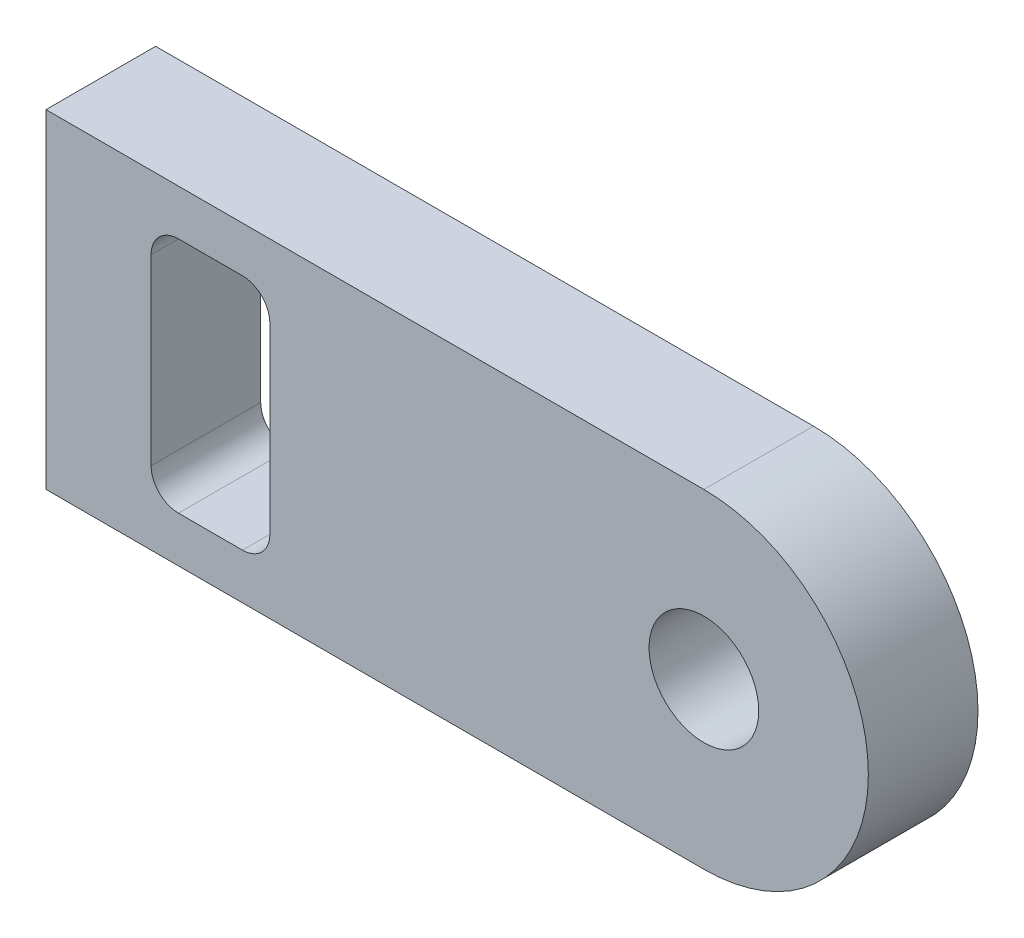
ISO-10303-21;
HEADER;
FILE_DESCRIPTION(('STEP AP214'),'2;1');
FILE_NAME('part.step','',(''),(''),'','','');
FILE_SCHEMA(('AUTOMOTIVE_DESIGN { 1 0 10303 214 1 1 1 1 }'));
ENDSEC;
DATA;
#1=APPLICATION_CONTEXT('core data for automotive mechanical design processes');
#2=APPLICATION_PROTOCOL_DEFINITION('international standard','automotive_design',2000,#1);
#3=PRODUCT_CONTEXT('',#1,'mechanical');
#4=PRODUCT('Part','Part','',(#3));
#5=PRODUCT_RELATED_PRODUCT_CATEGORY('part','',(#4));
#6=PRODUCT_DEFINITION_FORMATION('','',#4);
#7=PRODUCT_DEFINITION_CONTEXT('part definition',#1,'design');
#8=PRODUCT_DEFINITION('design','',#6,#7);
#9=PRODUCT_DEFINITION_SHAPE('','',#8);
#10=(LENGTH_UNIT() NAMED_UNIT(*) SI_UNIT(.MILLI.,.METRE.));
#11=(NAMED_UNIT(*) PLANE_ANGLE_UNIT() SI_UNIT($,.RADIAN.));
#12=(NAMED_UNIT(*) SI_UNIT($,.STERADIAN.) SOLID_ANGLE_UNIT());
#13=UNCERTAINTY_MEASURE_WITH_UNIT(LENGTH_MEASURE(1.E-05),#10,'distance_accuracy_value','');
#14=(GEOMETRIC_REPRESENTATION_CONTEXT(3) GLOBAL_UNCERTAINTY_ASSIGNED_CONTEXT((#13)) GLOBAL_UNIT_ASSIGNED_CONTEXT((#10,
#11,#12)) REPRESENTATION_CONTEXT('',''));
#15=CARTESIAN_POINT('',(0.,0.,0.));
#16=DIRECTION('',(0.,0.,1.));
#17=DIRECTION('',(1.,0.,0.));
#18=AXIS2_PLACEMENT_3D('',#15,#16,#17);
#19=CARTESIAN_POINT('',(201.0978533093,269.1465473352,3.));
#20=DIRECTION('',(0.,0.,1.));
#21=DIRECTION('',(1.,0.,0.));
#22=AXIS2_PLACEMENT_3D('',#19,#20,#21);
#23=PLANE('',#22);
#24=CARTESIAN_POINT('',(201.0978533093,269.1465473352,3.));
#25=DIRECTION('',(0.,0.,1.));
#26=DIRECTION('',(1.,0.,0.));
#27=AXIS2_PLACEMENT_3D('',#24,#25,#26);
#28=CIRCLE('',#27,1.5);
#29=CARTESIAN_POINT('',(202.5978533093,269.1465473352,3.));
#30=VERTEX_POINT('',#29);
#31=EDGE_CURVE('E187',#30,#30,#28,.T.);
#32=ORIENTED_EDGE('',*,*,#31,.F.);
#33=EDGE_LOOP('',(#32));
#34=FACE_BOUND('',#33,.T.);
#35=CARTESIAN_POINT('',(201.0978533093,269.1465473352,3.));
#36=DIRECTION('',(0.,0.,1.));
#37=DIRECTION('',(1.,0.,0.));
#38=AXIS2_PLACEMENT_3D('',#35,#36,#37);
#39=CIRCLE('',#38,4.49999999999998);
#40=CARTESIAN_POINT('',(201.0978533093,264.6465473352,3.));
#41=VERTEX_POINT('',#40);
#42=CARTESIAN_POINT('',(201.0978533093,273.6465473352,3.));
#43=VERTEX_POINT('',#42);
#44=EDGE_CURVE('E193',#41,#43,#39,.T.);
#45=ORIENTED_EDGE('',*,*,#44,.T.);
#46=DIRECTION('',(-1.,0.,0.));
#47=VECTOR('',#46,1.);
#48=CARTESIAN_POINT('',(183.0978533093,273.6465473352,3.));
#49=LINE('',#48,#47);
#50=CARTESIAN_POINT('',(183.0978533093,273.6465473352,3.));
#51=VERTEX_POINT('',#50);
#52=EDGE_CURVE('E196',#43,#51,#49,.T.);
#53=ORIENTED_EDGE('',*,*,#52,.T.);
#54=DIRECTION('',(0.,-1.,0.));
#55=VECTOR('',#54,1.);
#56=CARTESIAN_POINT('',(183.0978533093,264.6465473352,3.));
#57=LINE('',#56,#55);
#58=CARTESIAN_POINT('',(183.0978533093,264.6465473352,3.));
#59=VERTEX_POINT('',#58);
#60=EDGE_CURVE('E199',#51,#59,#57,.T.);
#61=ORIENTED_EDGE('',*,*,#60,.T.);
#62=DIRECTION('',(1.,0.,0.));
#63=VECTOR('',#62,1.);
#64=CARTESIAN_POINT('',(201.0978533093,264.6465473352,3.));
#65=LINE('',#64,#63);
#66=EDGE_CURVE('E201',#59,#41,#65,.T.);
#67=ORIENTED_EDGE('',*,*,#66,.T.);
#68=EDGE_LOOP('',(#45,#53,#61,#67));
#69=FACE_BOUND('',#68,.T.);
#70=DIRECTION('',(1.,0.,0.));
#71=VECTOR('',#70,1.);
#72=CARTESIAN_POINT('',(186.7228533093,265.8965473352,3.));
#73=LINE('',#72,#71);
#74=CARTESIAN_POINT('',(186.7228533093,265.8965473352,3.));
#75=VERTEX_POINT('',#74);
#76=CARTESIAN_POINT('',(188.4728533093,265.8965473352,3.));
#77=VERTEX_POINT('',#76);
#78=EDGE_CURVE('E130',#75,#77,#73,.T.);
#79=ORIENTED_EDGE('',*,*,#78,.F.);
#80=CARTESIAN_POINT('',(186.7228533093,266.6465473352,3.));
#81=DIRECTION('',(0.,0.,1.));
#82=DIRECTION('',(1.,0.,0.));
#83=AXIS2_PLACEMENT_3D('',#80,#81,#82);
#84=CIRCLE('',#83,0.749999999999987);
#85=CARTESIAN_POINT('',(185.9728533093,266.6465473352,3.));
#86=VERTEX_POINT('',#85);
#87=EDGE_CURVE('E122',#86,#75,#84,.T.);
#88=ORIENTED_EDGE('',*,*,#87,.F.);
#89=DIRECTION('',(0.,-1.,0.));
#90=VECTOR('',#89,1.);
#91=CARTESIAN_POINT('',(185.9728533093,271.6465473352,3.));
#92=LINE('',#91,#90);
#93=CARTESIAN_POINT('',(185.9728533093,271.6465473352,3.));
#94=VERTEX_POINT('',#93);
#95=EDGE_CURVE('E155',#94,#86,#92,.T.);
#96=ORIENTED_EDGE('',*,*,#95,.F.);
#97=CARTESIAN_POINT('',(186.7228533093,271.6465473352,3.));
#98=DIRECTION('',(0.,0.,1.));
#99=DIRECTION('',(1.,0.,0.));
#100=AXIS2_PLACEMENT_3D('',#97,#98,#99);
#101=CIRCLE('',#100,0.750000000000015);
#102=CARTESIAN_POINT('',(186.7228533093,272.3965473352,3.));
#103=VERTEX_POINT('',#102);
#104=EDGE_CURVE('E153',#103,#94,#101,.T.);
#105=ORIENTED_EDGE('',*,*,#104,.F.);
#106=DIRECTION('',(-1.,0.,0.));
#107=VECTOR('',#106,1.);
#108=CARTESIAN_POINT('',(188.4728533093,272.3965473352,3.));
#109=LINE('',#108,#107);
#110=CARTESIAN_POINT('',(188.4728533093,272.3965473352,3.));
#111=VERTEX_POINT('',#110);
#112=EDGE_CURVE('E151',#111,#103,#109,.T.);
#113=ORIENTED_EDGE('',*,*,#112,.F.);
#114=CARTESIAN_POINT('',(188.4728533093,271.6465473352,3.));
#115=DIRECTION('',(0.,0.,1.));
#116=DIRECTION('',(1.,0.,0.));
#117=AXIS2_PLACEMENT_3D('',#114,#115,#116);
#118=CIRCLE('',#117,0.750000000000015);
#119=CARTESIAN_POINT('',(189.2228533093,271.6465473352,3.));
#120=VERTEX_POINT('',#119);
#121=EDGE_CURVE('E149',#120,#111,#118,.T.);
#122=ORIENTED_EDGE('',*,*,#121,.F.);
#123=DIRECTION('',(0.,1.,0.));
#124=VECTOR('',#123,1.);
#125=CARTESIAN_POINT('',(189.2228533093,266.6465473352,3.));
#126=LINE('',#125,#124);
#127=CARTESIAN_POINT('',(189.2228533093,266.6465473352,3.));
#128=VERTEX_POINT('',#127);
#129=EDGE_CURVE('E145',#128,#120,#126,.T.);
#130=ORIENTED_EDGE('',*,*,#129,.F.);
#131=CARTESIAN_POINT('',(188.4728533093,266.6465473352,3.));
#132=DIRECTION('',(0.,0.,1.));
#133=DIRECTION('',(1.,0.,0.));
#134=AXIS2_PLACEMENT_3D('',#131,#132,#133);
#135=CIRCLE('',#134,0.749999999999987);
#136=EDGE_CURVE('E143',#77,#128,#135,.T.);
#137=ORIENTED_EDGE('',*,*,#136,.F.);
#138=EDGE_LOOP('',(#79,#88,#96,#105,#113,#122,#130,#137));
#139=FACE_BOUND('',#138,.T.);
#140=ADVANCED_FACE('F33',(#34,#69,#139),#23,.T.);
#141=CARTESIAN_POINT('',(201.0978533093,269.1465473352,0.));
#142=DIRECTION('',(0.,0.,1.));
#143=DIRECTION('',(1.,0.,0.));
#144=AXIS2_PLACEMENT_3D('',#141,#142,#143);
#145=PLANE('',#144);
#146=CARTESIAN_POINT('',(201.0978533093,269.1465473352,0.));
#147=DIRECTION('',(0.,0.,1.));
#148=DIRECTION('',(1.,0.,0.));
#149=AXIS2_PLACEMENT_3D('',#146,#147,#148);
#150=CIRCLE('',#149,1.5);
#151=CARTESIAN_POINT('',(202.5978533093,269.1465473352,0.));
#152=VERTEX_POINT('',#151);
#153=EDGE_CURVE('E138',#152,#152,#150,.T.);
#154=ORIENTED_EDGE('',*,*,#153,.T.);
#155=EDGE_LOOP('',(#154));
#156=FACE_BOUND('',#155,.T.);
#157=CARTESIAN_POINT('',(201.0978533093,269.1465473352,0.));
#158=DIRECTION('',(0.,0.,1.));
#159=DIRECTION('',(1.,0.,0.));
#160=AXIS2_PLACEMENT_3D('',#157,#158,#159);
#161=CIRCLE('',#160,4.49999999999998);
#162=CARTESIAN_POINT('',(201.0978533093,264.6465473352,0.));
#163=VERTEX_POINT('',#162);
#164=CARTESIAN_POINT('',(201.0978533093,273.6465473352,0.));
#165=VERTEX_POINT('',#164);
#166=EDGE_CURVE('E190',#163,#165,#161,.T.);
#167=ORIENTED_EDGE('',*,*,#166,.F.);
#168=DIRECTION('',(1.,0.,0.));
#169=VECTOR('',#168,1.);
#170=CARTESIAN_POINT('',(201.0978533093,264.6465473352,0.));
#171=LINE('',#170,#169);
#172=CARTESIAN_POINT('',(183.0978533093,264.6465473352,0.));
#173=VERTEX_POINT('',#172);
#174=EDGE_CURVE('E197',#173,#163,#171,.T.);
#175=ORIENTED_EDGE('',*,*,#174,.F.);
#176=DIRECTION('',(0.,-1.,0.));
#177=VECTOR('',#176,1.);
#178=CARTESIAN_POINT('',(183.0978533093,264.6465473352,0.));
#179=LINE('',#178,#177);
#180=CARTESIAN_POINT('',(183.0978533093,273.6465473352,0.));
#181=VERTEX_POINT('',#180);
#182=EDGE_CURVE('E208',#181,#173,#179,.T.);
#183=ORIENTED_EDGE('',*,*,#182,.F.);
#184=DIRECTION('',(-1.,0.,0.));
#185=VECTOR('',#184,1.);
#186=CARTESIAN_POINT('',(183.0978533093,273.6465473352,0.));
#187=LINE('',#186,#185);
#188=EDGE_CURVE('E206',#165,#181,#187,.T.);
#189=ORIENTED_EDGE('',*,*,#188,.F.);
#190=EDGE_LOOP('',(#167,#175,#183,#189));
#191=FACE_BOUND('',#190,.T.);
#192=CARTESIAN_POINT('',(186.7228533093,266.6465473352,0.));
#193=DIRECTION('',(0.,0.,1.));
#194=DIRECTION('',(1.,0.,0.));
#195=AXIS2_PLACEMENT_3D('',#192,#193,#194);
#196=CIRCLE('',#195,0.749999999999987);
#197=CARTESIAN_POINT('',(185.9728533093,266.6465473352,0.));
#198=VERTEX_POINT('',#197);
#199=CARTESIAN_POINT('',(186.7228533093,265.8965473352,0.));
#200=VERTEX_POINT('',#199);
#201=EDGE_CURVE('E56',#198,#200,#196,.T.);
#202=ORIENTED_EDGE('',*,*,#201,.T.);
#203=DIRECTION('',(1.,0.,0.));
#204=VECTOR('',#203,1.);
#205=CARTESIAN_POINT('',(186.7228533093,265.8965473352,0.));
#206=LINE('',#205,#204);
#207=CARTESIAN_POINT('',(188.4728533093,265.8965473352,0.));
#208=VERTEX_POINT('',#207);
#209=EDGE_CURVE('E137',#200,#208,#206,.T.);
#210=ORIENTED_EDGE('',*,*,#209,.T.);
#211=CARTESIAN_POINT('',(188.4728533093,266.6465473352,0.));
#212=DIRECTION('',(0.,0.,1.));
#213=DIRECTION('',(1.,0.,0.));
#214=AXIS2_PLACEMENT_3D('',#211,#212,#213);
#215=CIRCLE('',#214,0.749999999999987);
#216=CARTESIAN_POINT('',(189.2228533093,266.6465473352,0.));
#217=VERTEX_POINT('',#216);
#218=EDGE_CURVE('E159',#208,#217,#215,.T.);
#219=ORIENTED_EDGE('',*,*,#218,.T.);
#220=DIRECTION('',(0.,1.,0.));
#221=VECTOR('',#220,1.);
#222=CARTESIAN_POINT('',(189.2228533093,266.6465473352,0.));
#223=LINE('',#222,#221);
#224=CARTESIAN_POINT('',(189.2228533093,271.6465473352,0.));
#225=VERTEX_POINT('',#224);
#226=EDGE_CURVE('E162',#217,#225,#223,.T.);
#227=ORIENTED_EDGE('',*,*,#226,.T.);
#228=CARTESIAN_POINT('',(188.4728533093,271.6465473352,0.));
#229=DIRECTION('',(0.,0.,1.));
#230=DIRECTION('',(1.,0.,0.));
#231=AXIS2_PLACEMENT_3D('',#228,#229,#230);
#232=CIRCLE('',#231,0.750000000000015);
#233=CARTESIAN_POINT('',(188.4728533093,272.3965473352,0.));
#234=VERTEX_POINT('',#233);
#235=EDGE_CURVE('E165',#225,#234,#232,.T.);
#236=ORIENTED_EDGE('',*,*,#235,.T.);
#237=DIRECTION('',(-1.,0.,0.));
#238=VECTOR('',#237,1.);
#239=CARTESIAN_POINT('',(188.4728533093,272.3965473352,0.));
#240=LINE('',#239,#238);
#241=CARTESIAN_POINT('',(186.7228533093,272.3965473352,0.));
#242=VERTEX_POINT('',#241);
#243=EDGE_CURVE('E168',#234,#242,#240,.T.);
#244=ORIENTED_EDGE('',*,*,#243,.T.);
#245=CARTESIAN_POINT('',(186.7228533093,271.6465473352,0.));
#246=DIRECTION('',(0.,0.,1.));
#247=DIRECTION('',(1.,0.,0.));
#248=AXIS2_PLACEMENT_3D('',#245,#246,#247);
#249=CIRCLE('',#248,0.750000000000015);
#250=CARTESIAN_POINT('',(185.9728533093,271.6465473352,0.));
#251=VERTEX_POINT('',#250);
#252=EDGE_CURVE('E171',#242,#251,#249,.T.);
#253=ORIENTED_EDGE('',*,*,#252,.T.);
#254=DIRECTION('',(0.,-1.,0.));
#255=VECTOR('',#254,1.);
#256=CARTESIAN_POINT('',(185.9728533093,271.6465473352,0.));
#257=LINE('',#256,#255);
#258=EDGE_CURVE('E131',#251,#198,#257,.T.);
#259=ORIENTED_EDGE('',*,*,#258,.T.);
#260=EDGE_LOOP('',(#202,#210,#219,#227,#236,#244,#253,#259));
#261=FACE_BOUND('',#260,.T.);
#262=ADVANCED_FACE('F226',(#156,#191,#261),#145,.F.);
#263=CARTESIAN_POINT('',(201.0978533093,269.1465473352,3.));
#264=DIRECTION('',(0.,0.,-1.));
#265=DIRECTION('',(-1.,0.,0.));
#266=AXIS2_PLACEMENT_3D('',#263,#264,#265);
#267=CYLINDRICAL_SURFACE('',#266,4.49999999999998);
#268=ORIENTED_EDGE('',*,*,#166,.T.);
#269=DIRECTION('',(0.,0.,-1.));
#270=VECTOR('',#269,1.);
#271=CARTESIAN_POINT('',(201.0978533093,273.6465473352,3.));
#272=LINE('',#271,#270);
#273=EDGE_CURVE('E11',#43,#165,#272,.T.);
#274=ORIENTED_EDGE('',*,*,#273,.F.);
#275=ORIENTED_EDGE('',*,*,#44,.F.);
#276=DIRECTION('',(0.,0.,-1.));
#277=VECTOR('',#276,1.);
#278=CARTESIAN_POINT('',(201.0978533093,264.6465473352,3.));
#279=LINE('',#278,#277);
#280=EDGE_CURVE('E203',#41,#163,#279,.T.);
#281=ORIENTED_EDGE('',*,*,#280,.T.);
#282=EDGE_LOOP('',(#268,#274,#275,#281));
#283=FACE_BOUND('',#282,.T.);
#284=ADVANCED_FACE('F35',(#283),#267,.T.);
#285=CARTESIAN_POINT('',(183.0978533093,273.6465473352,3.));
#286=DIRECTION('',(0.,-1.,0.));
#287=DIRECTION('',(0.,0.,-1.));
#288=AXIS2_PLACEMENT_3D('',#285,#286,#287);
#289=PLANE('',#288);
#290=ORIENTED_EDGE('',*,*,#188,.T.);
#291=DIRECTION('',(0.,0.,-1.));
#292=VECTOR('',#291,1.);
#293=CARTESIAN_POINT('',(183.0978533093,273.6465473352,3.));
#294=LINE('',#293,#292);
#295=EDGE_CURVE('E41',#51,#181,#294,.T.);
#296=ORIENTED_EDGE('',*,*,#295,.F.);
#297=ORIENTED_EDGE('',*,*,#52,.F.);
#298=ORIENTED_EDGE('',*,*,#273,.T.);
#299=EDGE_LOOP('',(#290,#296,#297,#298));
#300=FACE_BOUND('',#299,.T.);
#301=ADVANCED_FACE('F236',(#300),#289,.F.);
#302=CARTESIAN_POINT('',(183.0978533093,264.6465473352,3.));
#303=DIRECTION('',(1.,0.,0.));
#304=DIRECTION('',(0.,0.,-1.));
#305=AXIS2_PLACEMENT_3D('',#302,#303,#304);
#306=PLANE('',#305);
#307=ORIENTED_EDGE('',*,*,#182,.T.);
#308=DIRECTION('',(0.,0.,-1.));
#309=VECTOR('',#308,1.);
#310=CARTESIAN_POINT('',(183.0978533093,264.6465473352,3.));
#311=LINE('',#310,#309);
#312=EDGE_CURVE('E213',#59,#173,#311,.T.);
#313=ORIENTED_EDGE('',*,*,#312,.F.);
#314=ORIENTED_EDGE('',*,*,#60,.F.);
#315=ORIENTED_EDGE('',*,*,#295,.T.);
#316=EDGE_LOOP('',(#307,#313,#314,#315));
#317=FACE_BOUND('',#316,.T.);
#318=ADVANCED_FACE('F220',(#317),#306,.F.);
#319=CARTESIAN_POINT('',(201.0978533093,264.6465473352,3.));
#320=DIRECTION('',(0.,1.,0.));
#321=DIRECTION('',(0.,0.,1.));
#322=AXIS2_PLACEMENT_3D('',#319,#320,#321);
#323=PLANE('',#322);
#324=ORIENTED_EDGE('',*,*,#174,.T.);
#325=ORIENTED_EDGE('',*,*,#280,.F.);
#326=ORIENTED_EDGE('',*,*,#66,.F.);
#327=ORIENTED_EDGE('',*,*,#312,.T.);
#328=EDGE_LOOP('',(#324,#325,#326,#327));
#329=FACE_BOUND('',#328,.T.);
#330=ADVANCED_FACE('F230',(#329),#323,.F.);
#331=CARTESIAN_POINT('',(201.0978533093,269.1465473352,3.));
#332=DIRECTION('',(0.,0.,-1.));
#333=DIRECTION('',(-1.,0.,0.));
#334=AXIS2_PLACEMENT_3D('',#331,#332,#333);
#335=CYLINDRICAL_SURFACE('',#334,1.5);
#336=ORIENTED_EDGE('',*,*,#31,.T.);
#337=EDGE_LOOP('',(#336));
#338=FACE_BOUND('',#337,.T.);
#339=ORIENTED_EDGE('',*,*,#153,.F.);
#340=EDGE_LOOP('',(#339));
#341=FACE_BOUND('',#340,.T.);
#342=ADVANCED_FACE('F253',(#338,#341),#335,.F.);
#343=CARTESIAN_POINT('',(186.7228533093,266.6465473352,3.));
#344=DIRECTION('',(0.,0.,-1.));
#345=DIRECTION('',(-1.,0.,0.));
#346=AXIS2_PLACEMENT_3D('',#343,#344,#345);
#347=CYLINDRICAL_SURFACE('',#346,0.749999999999987);
#348=ORIENTED_EDGE('',*,*,#201,.F.);
#349=DIRECTION('',(0.,0.,-1.));
#350=VECTOR('',#349,1.);
#351=CARTESIAN_POINT('',(185.9728533093,266.6465473352,3.));
#352=LINE('',#351,#350);
#353=EDGE_CURVE('E126',#86,#198,#352,.T.);
#354=ORIENTED_EDGE('',*,*,#353,.F.);
#355=ORIENTED_EDGE('',*,*,#87,.T.);
#356=DIRECTION('',(0.,0.,-1.));
#357=VECTOR('',#356,1.);
#358=CARTESIAN_POINT('',(186.7228533093,265.8965473352,3.));
#359=LINE('',#358,#357);
#360=EDGE_CURVE('E125',#75,#200,#359,.T.);
#361=ORIENTED_EDGE('',*,*,#360,.T.);
#362=EDGE_LOOP('',(#348,#354,#355,#361));
#363=FACE_BOUND('',#362,.T.);
#364=ADVANCED_FACE('F124',(#363),#347,.F.);
#365=CARTESIAN_POINT('',(186.7228533093,265.8965473352,3.));
#366=DIRECTION('',(0.,1.,0.));
#367=DIRECTION('',(0.,0.,1.));
#368=AXIS2_PLACEMENT_3D('',#365,#366,#367);
#369=PLANE('',#368);
#370=ORIENTED_EDGE('',*,*,#209,.F.);
#371=ORIENTED_EDGE('',*,*,#360,.F.);
#372=ORIENTED_EDGE('',*,*,#78,.T.);
#373=DIRECTION('',(0.,0.,-1.));
#374=VECTOR('',#373,1.);
#375=CARTESIAN_POINT('',(188.4728533093,265.8965473352,3.));
#376=LINE('',#375,#374);
#377=EDGE_CURVE('E139',#77,#208,#376,.T.);
#378=ORIENTED_EDGE('',*,*,#377,.T.);
#379=EDGE_LOOP('',(#370,#371,#372,#378));
#380=FACE_BOUND('',#379,.T.);
#381=ADVANCED_FACE('F134',(#380),#369,.T.);
#382=CARTESIAN_POINT('',(188.4728533093,266.6465473352,3.));
#383=DIRECTION('',(0.,0.,-1.));
#384=DIRECTION('',(-1.,0.,0.));
#385=AXIS2_PLACEMENT_3D('',#382,#383,#384);
#386=CYLINDRICAL_SURFACE('',#385,0.749999999999987);
#387=ORIENTED_EDGE('',*,*,#218,.F.);
#388=ORIENTED_EDGE('',*,*,#377,.F.);
#389=ORIENTED_EDGE('',*,*,#136,.T.);
#390=DIRECTION('',(0.,0.,-1.));
#391=VECTOR('',#390,1.);
#392=CARTESIAN_POINT('',(189.2228533093,266.6465473352,3.));
#393=LINE('',#392,#391);
#394=EDGE_CURVE('E184',#128,#217,#393,.T.);
#395=ORIENTED_EDGE('',*,*,#394,.T.);
#396=EDGE_LOOP('',(#387,#388,#389,#395));
#397=FACE_BOUND('',#396,.T.);
#398=ADVANCED_FACE('F269',(#397),#386,.F.);
#399=CARTESIAN_POINT('',(189.2228533093,266.6465473352,3.));
#400=DIRECTION('',(-1.,0.,0.));
#401=DIRECTION('',(0.,0.,1.));
#402=AXIS2_PLACEMENT_3D('',#399,#400,#401);
#403=PLANE('',#402);
#404=ORIENTED_EDGE('',*,*,#226,.F.);
#405=ORIENTED_EDGE('',*,*,#394,.F.);
#406=ORIENTED_EDGE('',*,*,#129,.T.);
#407=DIRECTION('',(0.,0.,-1.));
#408=VECTOR('',#407,1.);
#409=CARTESIAN_POINT('',(189.2228533093,271.6465473352,3.));
#410=LINE('',#409,#408);
#411=EDGE_CURVE('E182',#120,#225,#410,.T.);
#412=ORIENTED_EDGE('',*,*,#411,.T.);
#413=EDGE_LOOP('',(#404,#405,#406,#412));
#414=FACE_BOUND('',#413,.T.);
#415=ADVANCED_FACE('F274',(#414),#403,.T.);
#416=CARTESIAN_POINT('',(188.4728533093,271.6465473352,3.));
#417=DIRECTION('',(0.,0.,-1.));
#418=DIRECTION('',(-1.,0.,0.));
#419=AXIS2_PLACEMENT_3D('',#416,#417,#418);
#420=CYLINDRICAL_SURFACE('',#419,0.750000000000015);
#421=ORIENTED_EDGE('',*,*,#235,.F.);
#422=ORIENTED_EDGE('',*,*,#411,.F.);
#423=ORIENTED_EDGE('',*,*,#121,.T.);
#424=DIRECTION('',(0.,0.,-1.));
#425=VECTOR('',#424,1.);
#426=CARTESIAN_POINT('',(188.4728533093,272.3965473352,3.));
#427=LINE('',#426,#425);
#428=EDGE_CURVE('E180',#111,#234,#427,.T.);
#429=ORIENTED_EDGE('',*,*,#428,.T.);
#430=EDGE_LOOP('',(#421,#422,#423,#429));
#431=FACE_BOUND('',#430,.T.);
#432=ADVANCED_FACE('F278',(#431),#420,.F.);
#433=CARTESIAN_POINT('',(188.4728533093,272.3965473352,3.));
#434=DIRECTION('',(0.,-1.,0.));
#435=DIRECTION('',(0.,0.,-1.));
#436=AXIS2_PLACEMENT_3D('',#433,#434,#435);
#437=PLANE('',#436);
#438=ORIENTED_EDGE('',*,*,#243,.F.);
#439=ORIENTED_EDGE('',*,*,#428,.F.);
#440=ORIENTED_EDGE('',*,*,#112,.T.);
#441=DIRECTION('',(0.,0.,-1.));
#442=VECTOR('',#441,1.);
#443=CARTESIAN_POINT('',(186.7228533093,272.3965473352,3.));
#444=LINE('',#443,#442);
#445=EDGE_CURVE('E178',#103,#242,#444,.T.);
#446=ORIENTED_EDGE('',*,*,#445,.T.);
#447=EDGE_LOOP('',(#438,#439,#440,#446));
#448=FACE_BOUND('',#447,.T.);
#449=ADVANCED_FACE('F282',(#448),#437,.T.);
#450=CARTESIAN_POINT('',(186.7228533093,271.6465473352,3.));
#451=DIRECTION('',(0.,0.,-1.));
#452=DIRECTION('',(-1.,0.,0.));
#453=AXIS2_PLACEMENT_3D('',#450,#451,#452);
#454=CYLINDRICAL_SURFACE('',#453,0.750000000000015);
#455=ORIENTED_EDGE('',*,*,#252,.F.);
#456=ORIENTED_EDGE('',*,*,#445,.F.);
#457=ORIENTED_EDGE('',*,*,#104,.T.);
#458=DIRECTION('',(0.,0.,-1.));
#459=VECTOR('',#458,1.);
#460=CARTESIAN_POINT('',(185.9728533093,271.6465473352,3.));
#461=LINE('',#460,#459);
#462=EDGE_CURVE('E48',#94,#251,#461,.T.);
#463=ORIENTED_EDGE('',*,*,#462,.T.);
#464=EDGE_LOOP('',(#455,#456,#457,#463));
#465=FACE_BOUND('',#464,.T.);
#466=ADVANCED_FACE('F286',(#465),#454,.F.);
#467=CARTESIAN_POINT('',(185.9728533093,271.6465473352,3.));
#468=DIRECTION('',(1.,0.,0.));
#469=DIRECTION('',(0.,0.,-1.));
#470=AXIS2_PLACEMENT_3D('',#467,#468,#469);
#471=PLANE('',#470);
#472=ORIENTED_EDGE('',*,*,#258,.F.);
#473=ORIENTED_EDGE('',*,*,#462,.F.);
#474=ORIENTED_EDGE('',*,*,#95,.T.);
#475=ORIENTED_EDGE('',*,*,#353,.T.);
#476=EDGE_LOOP('',(#472,#473,#474,#475));
#477=FACE_BOUND('',#476,.T.);
#478=ADVANCED_FACE('F290',(#477),#471,.T.);
#479=CLOSED_SHELL('',(#140,#262,#284,#301,#318,#330,#342,#364,#381,#398,#415,#432,#449,#466,#478));
#480=MANIFOLD_SOLID_BREP('B2',#479);
#481=ADVANCED_BREP_SHAPE_REPRESENTATION('',(#18,#480),#14);
#482=SHAPE_DEFINITION_REPRESENTATION(#9,#481);
ENDSEC;
END-ISO-10303-21;
